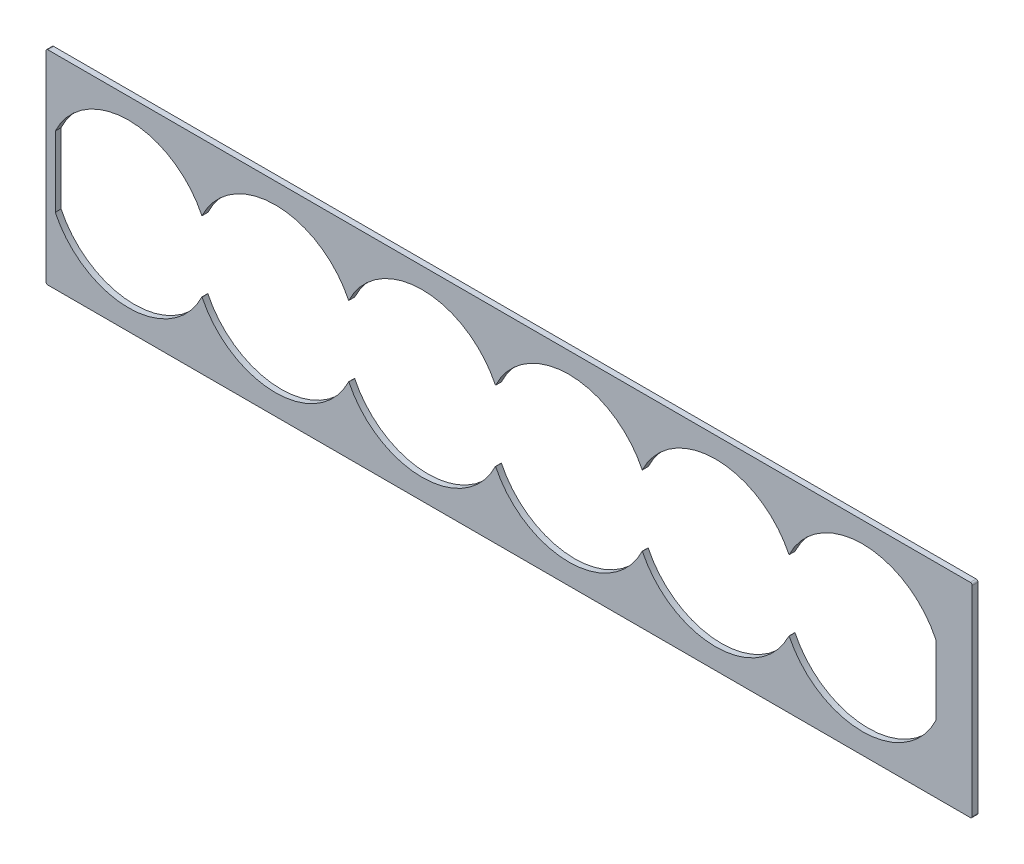
ISO-10303-21;
HEADER;
FILE_DESCRIPTION(('STEP AP214'),'2;1');
FILE_NAME('part.step','',(''),(''),'','','');
FILE_SCHEMA(('AUTOMOTIVE_DESIGN { 1 0 10303 214 1 1 1 1 }'));
ENDSEC;
DATA;
#1=APPLICATION_CONTEXT('core data for automotive mechanical design processes');
#2=APPLICATION_PROTOCOL_DEFINITION('international standard','automotive_design',2000,#1);
#3=PRODUCT_CONTEXT('',#1,'mechanical');
#4=PRODUCT('Part','Part','',(#3));
#5=PRODUCT_RELATED_PRODUCT_CATEGORY('part','',(#4));
#6=PRODUCT_DEFINITION_FORMATION('','',#4);
#7=PRODUCT_DEFINITION_CONTEXT('part definition',#1,'design');
#8=PRODUCT_DEFINITION('design','',#6,#7);
#9=PRODUCT_DEFINITION_SHAPE('','',#8);
#10=(LENGTH_UNIT() NAMED_UNIT(*) SI_UNIT(.MILLI.,.METRE.));
#11=(NAMED_UNIT(*) PLANE_ANGLE_UNIT() SI_UNIT($,.RADIAN.));
#12=(NAMED_UNIT(*) SI_UNIT($,.STERADIAN.) SOLID_ANGLE_UNIT());
#13=UNCERTAINTY_MEASURE_WITH_UNIT(LENGTH_MEASURE(1.E-05),#10,'distance_accuracy_value','');
#14=(GEOMETRIC_REPRESENTATION_CONTEXT(3) GLOBAL_UNCERTAINTY_ASSIGNED_CONTEXT((#13)) GLOBAL_UNIT_ASSIGNED_CONTEXT((#10,
#11,#12)) REPRESENTATION_CONTEXT('',''));
#15=CARTESIAN_POINT('',(0.,0.,0.));
#16=DIRECTION('',(0.,0.,1.));
#17=DIRECTION('',(1.,0.,0.));
#18=AXIS2_PLACEMENT_3D('',#15,#16,#17);
#19=CARTESIAN_POINT('',(0.,0.,4.));
#20=DIRECTION('',(0.,0.,-1.));
#21=DIRECTION('',(-1.,0.,0.));
#22=AXIS2_PLACEMENT_3D('',#19,#20,#21);
#23=PLANE('',#22);
#24=DIRECTION('',(0.,1.,0.));
#25=VECTOR('',#24,1.);
#26=CARTESIAN_POINT('',(635.,0.,4.));
#27=LINE('',#26,#25);
#28=CARTESIAN_POINT('',(635.,1.27,4.));
#29=VERTEX_POINT('',#28);
#30=CARTESIAN_POINT('',(635.,138.43,4.));
#31=VERTEX_POINT('',#30);
#32=EDGE_CURVE('E430',#29,#31,#27,.T.);
#33=ORIENTED_EDGE('',*,*,#32,.T.);
#34=CARTESIAN_POINT('',(633.73,138.43,4.));
#35=DIRECTION('',(0.,0.,-1.));
#36=DIRECTION('',(-1.,0.,0.));
#37=AXIS2_PLACEMENT_3D('',#34,#35,#36);
#38=CIRCLE('',#37,1.27);
#39=CARTESIAN_POINT('',(633.73,139.7,4.));
#40=VERTEX_POINT('',#39);
#41=EDGE_CURVE('E473',#31,#40,#38,.F.);
#42=ORIENTED_EDGE('',*,*,#41,.T.);
#43=DIRECTION('',(-1.,0.,0.));
#44=VECTOR('',#43,1.);
#45=CARTESIAN_POINT('',(0.,139.7,4.));
#46=LINE('',#45,#44);
#47=CARTESIAN_POINT('',(1.27000000000001,139.7,4.));
#48=VERTEX_POINT('',#47);
#49=EDGE_CURVE('E433',#40,#48,#46,.T.);
#50=ORIENTED_EDGE('',*,*,#49,.T.);
#51=CARTESIAN_POINT('',(1.27000000000001,138.43,4.));
#52=DIRECTION('',(0.,0.,-1.));
#53=DIRECTION('',(-1.,0.,0.));
#54=AXIS2_PLACEMENT_3D('',#51,#52,#53);
#55=CIRCLE('',#54,1.27);
#56=CARTESIAN_POINT('',(0.,138.43,4.));
#57=VERTEX_POINT('',#56);
#58=EDGE_CURVE('E470',#48,#57,#55,.F.);
#59=ORIENTED_EDGE('',*,*,#58,.T.);
#60=DIRECTION('',(0.,-1.,0.));
#61=VECTOR('',#60,1.);
#62=CARTESIAN_POINT('',(0.,0.,4.));
#63=LINE('',#62,#61);
#64=CARTESIAN_POINT('',(0.,1.27,4.));
#65=VERTEX_POINT('',#64);
#66=EDGE_CURVE('E437',#57,#65,#63,.T.);
#67=ORIENTED_EDGE('',*,*,#66,.T.);
#68=CARTESIAN_POINT('',(1.27,1.27,4.));
#69=DIRECTION('',(0.,0.,-1.));
#70=DIRECTION('',(-1.,0.,0.));
#71=AXIS2_PLACEMENT_3D('',#68,#69,#70);
#72=CIRCLE('',#71,1.27);
#73=CARTESIAN_POINT('',(1.27,0.,4.));
#74=VERTEX_POINT('',#73);
#75=EDGE_CURVE('E59',#65,#74,#72,.F.);
#76=ORIENTED_EDGE('',*,*,#75,.T.);
#77=DIRECTION('',(1.,0.,0.));
#78=VECTOR('',#77,1.);
#79=CARTESIAN_POINT('',(0.,0.,4.));
#80=LINE('',#79,#78);
#81=CARTESIAN_POINT('',(633.73,0.,4.));
#82=VERTEX_POINT('',#81);
#83=EDGE_CURVE('E439',#74,#82,#80,.T.);
#84=ORIENTED_EDGE('',*,*,#83,.T.);
#85=CARTESIAN_POINT('',(633.73,1.27,4.));
#86=DIRECTION('',(0.,0.,-1.));
#87=DIRECTION('',(-1.,0.,0.));
#88=AXIS2_PLACEMENT_3D('',#85,#86,#87);
#89=CIRCLE('',#88,1.27);
#90=EDGE_CURVE('E468',#82,#29,#89,.F.);
#91=ORIENTED_EDGE('',*,*,#90,.T.);
#92=EDGE_LOOP('',(#33,#42,#50,#59,#67,#76,#84,#91));
#93=FACE_BOUND('',#92,.T.);
#94=CARTESIAN_POINT('',(56.604,69.8499999999999,4.));
#95=DIRECTION('',(0.,0.,1.));
#96=DIRECTION('',(1.,0.,0.));
#97=AXIS2_PLACEMENT_3D('',#94,#95,#96);
#98=CIRCLE('',#97,55.754);
#99=CARTESIAN_POINT('',(106.858,93.9963040650116,4.));
#100=VERTEX_POINT('',#99);
#101=CARTESIAN_POINT('',(6.35,93.9963040650116,4.));
#102=VERTEX_POINT('',#101);
#103=EDGE_CURVE('E248',#100,#102,#98,.T.);
#104=ORIENTED_EDGE('',*,*,#103,.F.);
#105=DIRECTION('',(-1.,0.,0.));
#106=VECTOR('',#105,1.);
#107=CARTESIAN_POINT('',(106.858,93.9963040650116,4.));
#108=LINE('',#107,#106);
#109=CARTESIAN_POINT('',(106.985,93.9963040650116,4.));
#110=VERTEX_POINT('',#109);
#111=EDGE_CURVE('E316',#110,#100,#108,.T.);
#112=ORIENTED_EDGE('',*,*,#111,.F.);
#113=CARTESIAN_POINT('',(157.239,69.8499999999999,4.));
#114=DIRECTION('',(0.,0.,1.));
#115=DIRECTION('',(1.,0.,0.));
#116=AXIS2_PLACEMENT_3D('',#113,#114,#115);
#117=CIRCLE('',#116,55.754);
#118=CARTESIAN_POINT('',(207.493,93.9963040650116,4.));
#119=VERTEX_POINT('',#118);
#120=EDGE_CURVE('E313',#119,#110,#117,.T.);
#121=ORIENTED_EDGE('',*,*,#120,.F.);
#122=DIRECTION('',(-1.,0.,0.));
#123=VECTOR('',#122,1.);
#124=CARTESIAN_POINT('',(207.493,93.9963040650116,4.));
#125=LINE('',#124,#123);
#126=CARTESIAN_POINT('',(207.62,93.9963040650116,4.));
#127=VERTEX_POINT('',#126);
#128=EDGE_CURVE('E311',#127,#119,#125,.T.);
#129=ORIENTED_EDGE('',*,*,#128,.F.);
#130=CARTESIAN_POINT('',(257.874,69.8499999999999,4.));
#131=DIRECTION('',(0.,0.,1.));
#132=DIRECTION('',(1.,0.,0.));
#133=AXIS2_PLACEMENT_3D('',#130,#131,#132);
#134=CIRCLE('',#133,55.754);
#135=CARTESIAN_POINT('',(308.128,93.9963040650116,4.));
#136=VERTEX_POINT('',#135);
#137=EDGE_CURVE('E309',#136,#127,#134,.T.);
#138=ORIENTED_EDGE('',*,*,#137,.F.);
#139=DIRECTION('',(-1.,0.,0.));
#140=VECTOR('',#139,1.);
#141=CARTESIAN_POINT('',(308.128,93.9963040650116,4.));
#142=LINE('',#141,#140);
#143=CARTESIAN_POINT('',(308.255,93.9963040650116,4.));
#144=VERTEX_POINT('',#143);
#145=EDGE_CURVE('E307',#144,#136,#142,.T.);
#146=ORIENTED_EDGE('',*,*,#145,.F.);
#147=CARTESIAN_POINT('',(358.509,69.8499999999999,4.));
#148=DIRECTION('',(0.,0.,1.));
#149=DIRECTION('',(1.,0.,0.));
#150=AXIS2_PLACEMENT_3D('',#147,#148,#149);
#151=CIRCLE('',#150,55.754);
#152=CARTESIAN_POINT('',(408.763,93.9963040650116,4.));
#153=VERTEX_POINT('',#152);
#154=EDGE_CURVE('E305',#153,#144,#151,.T.);
#155=ORIENTED_EDGE('',*,*,#154,.F.);
#156=DIRECTION('',(-1.,0.,0.));
#157=VECTOR('',#156,1.);
#158=CARTESIAN_POINT('',(408.763,93.9963040650116,4.));
#159=LINE('',#158,#157);
#160=CARTESIAN_POINT('',(408.89,93.9963040650116,4.));
#161=VERTEX_POINT('',#160);
#162=EDGE_CURVE('E303',#161,#153,#159,.T.);
#163=ORIENTED_EDGE('',*,*,#162,.F.);
#164=CARTESIAN_POINT('',(459.144,69.8499999999999,4.));
#165=DIRECTION('',(0.,0.,1.));
#166=DIRECTION('',(1.,0.,0.));
#167=AXIS2_PLACEMENT_3D('',#164,#165,#166);
#168=CIRCLE('',#167,55.754);
#169=CARTESIAN_POINT('',(509.398,93.9963040650116,4.));
#170=VERTEX_POINT('',#169);
#171=EDGE_CURVE('E301',#170,#161,#168,.T.);
#172=ORIENTED_EDGE('',*,*,#171,.F.);
#173=DIRECTION('',(-1.,0.,0.));
#174=VECTOR('',#173,1.);
#175=CARTESIAN_POINT('',(509.398,93.9963040650116,4.));
#176=LINE('',#175,#174);
#177=CARTESIAN_POINT('',(509.525,93.9963040650116,4.));
#178=VERTEX_POINT('',#177);
#179=EDGE_CURVE('E299',#178,#170,#176,.T.);
#180=ORIENTED_EDGE('',*,*,#179,.F.);
#181=CARTESIAN_POINT('',(559.779,69.8499999999999,4.));
#182=DIRECTION('',(0.,0.,1.));
#183=DIRECTION('',(1.,0.,0.));
#184=AXIS2_PLACEMENT_3D('',#181,#182,#183);
#185=CIRCLE('',#184,55.754);
#186=CARTESIAN_POINT('',(610.033,93.9963040650116,4.));
#187=VERTEX_POINT('',#186);
#188=EDGE_CURVE('E297',#187,#178,#185,.T.);
#189=ORIENTED_EDGE('',*,*,#188,.F.);
#190=DIRECTION('',(0.,1.,0.));
#191=VECTOR('',#190,1.);
#192=CARTESIAN_POINT('',(610.033,93.9963040650116,4.));
#193=LINE('',#192,#191);
#194=CARTESIAN_POINT('',(610.033,45.7036959349883,4.));
#195=VERTEX_POINT('',#194);
#196=EDGE_CURVE('E295',#195,#187,#193,.T.);
#197=ORIENTED_EDGE('',*,*,#196,.F.);
#198=CARTESIAN_POINT('',(559.779,69.8499999999999,4.));
#199=DIRECTION('',(0.,0.,1.));
#200=DIRECTION('',(1.,0.,0.));
#201=AXIS2_PLACEMENT_3D('',#198,#199,#200);
#202=CIRCLE('',#201,55.754);
#203=CARTESIAN_POINT('',(509.525,45.7036959349884,4.));
#204=VERTEX_POINT('',#203);
#205=EDGE_CURVE('E293',#204,#195,#202,.T.);
#206=ORIENTED_EDGE('',*,*,#205,.F.);
#207=DIRECTION('',(1.,8.74191357972645E-13,0.));
#208=VECTOR('',#207,1.);
#209=CARTESIAN_POINT('',(509.398,45.7036959349883,4.));
#210=LINE('',#209,#208);
#211=CARTESIAN_POINT('',(509.398,45.7036959349883,4.));
#212=VERTEX_POINT('',#211);
#213=EDGE_CURVE('E291',#212,#204,#210,.T.);
#214=ORIENTED_EDGE('',*,*,#213,.F.);
#215=CARTESIAN_POINT('',(459.144,69.8499999999999,4.));
#216=DIRECTION('',(0.,0.,1.));
#217=DIRECTION('',(1.,0.,0.));
#218=AXIS2_PLACEMENT_3D('',#215,#216,#217);
#219=CIRCLE('',#218,55.754);
#220=CARTESIAN_POINT('',(408.89,45.7036959349884,4.));
#221=VERTEX_POINT('',#220);
#222=EDGE_CURVE('E289',#221,#212,#219,.T.);
#223=ORIENTED_EDGE('',*,*,#222,.F.);
#224=DIRECTION('',(1.,8.74191357972263E-13,0.));
#225=VECTOR('',#224,1.);
#226=CARTESIAN_POINT('',(408.763,45.7036959349883,4.));
#227=LINE('',#226,#225);
#228=CARTESIAN_POINT('',(408.763,45.7036959349883,4.));
#229=VERTEX_POINT('',#228);
#230=EDGE_CURVE('E287',#229,#221,#227,.T.);
#231=ORIENTED_EDGE('',*,*,#230,.F.);
#232=CARTESIAN_POINT('',(358.509,69.8499999999999,4.));
#233=DIRECTION('',(0.,0.,1.));
#234=DIRECTION('',(1.,0.,0.));
#235=AXIS2_PLACEMENT_3D('',#232,#233,#234);
#236=CIRCLE('',#235,55.754);
#237=CARTESIAN_POINT('',(308.255,45.7036959349884,4.));
#238=VERTEX_POINT('',#237);
#239=EDGE_CURVE('E285',#238,#229,#236,.T.);
#240=ORIENTED_EDGE('',*,*,#239,.F.);
#241=DIRECTION('',(1.,8.74191357971499E-13,0.));
#242=VECTOR('',#241,1.);
#243=CARTESIAN_POINT('',(308.128,45.7036959349883,4.));
#244=LINE('',#243,#242);
#245=CARTESIAN_POINT('',(308.128,45.7036959349883,4.));
#246=VERTEX_POINT('',#245);
#247=EDGE_CURVE('E283',#246,#238,#244,.T.);
#248=ORIENTED_EDGE('',*,*,#247,.F.);
#249=CARTESIAN_POINT('',(257.874,69.8499999999999,4.));
#250=DIRECTION('',(0.,0.,1.));
#251=DIRECTION('',(1.,0.,0.));
#252=AXIS2_PLACEMENT_3D('',#249,#250,#251);
#253=CIRCLE('',#252,55.754);
#254=CARTESIAN_POINT('',(207.62,45.7036959349884,4.));
#255=VERTEX_POINT('',#254);
#256=EDGE_CURVE('E281',#255,#246,#253,.T.);
#257=ORIENTED_EDGE('',*,*,#256,.F.);
#258=DIRECTION('',(1.,8.74191357973027E-13,0.));
#259=VECTOR('',#258,1.);
#260=CARTESIAN_POINT('',(207.62,45.7036959349884,4.));
#261=LINE('',#260,#259);
#262=CARTESIAN_POINT('',(207.493,45.7036959349883,4.));
#263=VERTEX_POINT('',#262);
#264=EDGE_CURVE('E279',#263,#255,#261,.T.);
#265=ORIENTED_EDGE('',*,*,#264,.F.);
#266=CARTESIAN_POINT('',(157.239,69.8499999999999,4.));
#267=DIRECTION('',(0.,0.,1.));
#268=DIRECTION('',(1.,0.,0.));
#269=AXIS2_PLACEMENT_3D('',#266,#267,#268);
#270=CIRCLE('',#269,55.754);
#271=CARTESIAN_POINT('',(106.985,45.7036959349884,4.));
#272=VERTEX_POINT('',#271);
#273=EDGE_CURVE('E277',#272,#263,#270,.T.);
#274=ORIENTED_EDGE('',*,*,#273,.F.);
#275=DIRECTION('',(1.,8.74191357973027E-13,0.));
#276=VECTOR('',#275,1.);
#277=CARTESIAN_POINT('',(106.985,45.7036959349884,4.));
#278=LINE('',#277,#276);
#279=CARTESIAN_POINT('',(106.858,45.7036959349883,4.));
#280=VERTEX_POINT('',#279);
#281=EDGE_CURVE('E273',#280,#272,#278,.T.);
#282=ORIENTED_EDGE('',*,*,#281,.F.);
#283=CARTESIAN_POINT('',(56.604,69.8499999999999,4.));
#284=DIRECTION('',(0.,0.,1.));
#285=DIRECTION('',(1.,0.,0.));
#286=AXIS2_PLACEMENT_3D('',#283,#284,#285);
#287=CIRCLE('',#286,55.754);
#288=CARTESIAN_POINT('',(6.35,45.7036959349884,4.));
#289=VERTEX_POINT('',#288);
#290=EDGE_CURVE('E271',#289,#280,#287,.T.);
#291=ORIENTED_EDGE('',*,*,#290,.F.);
#292=DIRECTION('',(0.,-1.,0.));
#293=VECTOR('',#292,1.);
#294=CARTESIAN_POINT('',(6.35,93.9963040650116,4.));
#295=LINE('',#294,#293);
#296=EDGE_CURVE('E258',#102,#289,#295,.T.);
#297=ORIENTED_EDGE('',*,*,#296,.F.);
#298=EDGE_LOOP('',(#104,#112,#121,#129,#138,#146,#155,#163,#172,#180,#189,#197,#206,#214,#223,
#231,#240,#248,#257,#265,#274,#282,#291,#297));
#299=FACE_BOUND('',#298,.T.);
#300=ADVANCED_FACE('F37',(#93,#299),#23,.F.);
#301=CARTESIAN_POINT('',(0.,0.,0.));
#302=DIRECTION('',(0.,0.,-1.));
#303=DIRECTION('',(-1.,0.,0.));
#304=AXIS2_PLACEMENT_3D('',#301,#302,#303);
#305=PLANE('',#304);
#306=DIRECTION('',(-1.,0.,0.));
#307=VECTOR('',#306,1.);
#308=CARTESIAN_POINT('',(0.,139.7,0.));
#309=LINE('',#308,#307);
#310=CARTESIAN_POINT('',(633.73,139.7,0.));
#311=VERTEX_POINT('',#310);
#312=CARTESIAN_POINT('',(1.27000000000001,139.7,0.));
#313=VERTEX_POINT('',#312);
#314=EDGE_CURVE('E444',#311,#313,#309,.T.);
#315=ORIENTED_EDGE('',*,*,#314,.F.);
#316=CARTESIAN_POINT('',(633.73,138.43,0.));
#317=DIRECTION('',(0.,0.,-1.));
#318=DIRECTION('',(-1.,0.,0.));
#319=AXIS2_PLACEMENT_3D('',#316,#317,#318);
#320=CIRCLE('',#319,1.27);
#321=CARTESIAN_POINT('',(635.,138.43,0.));
#322=VERTEX_POINT('',#321);
#323=EDGE_CURVE('E461',#311,#322,#320,.T.);
#324=ORIENTED_EDGE('',*,*,#323,.T.);
#325=DIRECTION('',(0.,1.,0.));
#326=VECTOR('',#325,1.);
#327=CARTESIAN_POINT('',(635.,0.,0.));
#328=LINE('',#327,#326);
#329=CARTESIAN_POINT('',(635.,1.27,0.));
#330=VERTEX_POINT('',#329);
#331=EDGE_CURVE('E266',#330,#322,#328,.T.);
#332=ORIENTED_EDGE('',*,*,#331,.F.);
#333=CARTESIAN_POINT('',(633.73,1.27,0.));
#334=DIRECTION('',(0.,0.,-1.));
#335=DIRECTION('',(-1.,0.,0.));
#336=AXIS2_PLACEMENT_3D('',#333,#334,#335);
#337=CIRCLE('',#336,1.27);
#338=CARTESIAN_POINT('',(633.73,0.,0.));
#339=VERTEX_POINT('',#338);
#340=EDGE_CURVE('E455',#330,#339,#337,.T.);
#341=ORIENTED_EDGE('',*,*,#340,.T.);
#342=DIRECTION('',(1.,0.,0.));
#343=VECTOR('',#342,1.);
#344=CARTESIAN_POINT('',(0.,0.,0.));
#345=LINE('',#344,#343);
#346=CARTESIAN_POINT('',(1.27,0.,0.));
#347=VERTEX_POINT('',#346);
#348=EDGE_CURVE('E434',#347,#339,#345,.T.);
#349=ORIENTED_EDGE('',*,*,#348,.F.);
#350=CARTESIAN_POINT('',(1.27,1.27,0.));
#351=DIRECTION('',(0.,0.,-1.));
#352=DIRECTION('',(-1.,0.,0.));
#353=AXIS2_PLACEMENT_3D('',#350,#351,#352);
#354=CIRCLE('',#353,1.27);
#355=CARTESIAN_POINT('',(0.,1.27,0.));
#356=VERTEX_POINT('',#355);
#357=EDGE_CURVE('E459',#347,#356,#354,.T.);
#358=ORIENTED_EDGE('',*,*,#357,.T.);
#359=DIRECTION('',(0.,-1.,0.));
#360=VECTOR('',#359,1.);
#361=CARTESIAN_POINT('',(0.,0.,0.));
#362=LINE('',#361,#360);
#363=CARTESIAN_POINT('',(0.,138.43,0.));
#364=VERTEX_POINT('',#363);
#365=EDGE_CURVE('E447',#364,#356,#362,.T.);
#366=ORIENTED_EDGE('',*,*,#365,.F.);
#367=CARTESIAN_POINT('',(1.27000000000001,138.43,0.));
#368=DIRECTION('',(0.,0.,-1.));
#369=DIRECTION('',(-1.,0.,0.));
#370=AXIS2_PLACEMENT_3D('',#367,#368,#369);
#371=CIRCLE('',#370,1.27);
#372=EDGE_CURVE('E457',#364,#313,#371,.T.);
#373=ORIENTED_EDGE('',*,*,#372,.T.);
#374=EDGE_LOOP('',(#315,#324,#332,#341,#349,#358,#366,#373));
#375=FACE_BOUND('',#374,.T.);
#376=DIRECTION('',(-1.,0.,0.));
#377=VECTOR('',#376,1.);
#378=CARTESIAN_POINT('',(106.858,93.9963040650116,0.));
#379=LINE('',#378,#377);
#380=CARTESIAN_POINT('',(106.985,93.9963040650116,0.));
#381=VERTEX_POINT('',#380);
#382=CARTESIAN_POINT('',(106.858,93.9963040650116,0.));
#383=VERTEX_POINT('',#382);
#384=EDGE_CURVE('E259',#381,#383,#379,.T.);
#385=ORIENTED_EDGE('',*,*,#384,.T.);
#386=CARTESIAN_POINT('',(56.604,69.8499999999999,0.));
#387=DIRECTION('',(0.,0.,1.));
#388=DIRECTION('',(1.,0.,0.));
#389=AXIS2_PLACEMENT_3D('',#386,#387,#388);
#390=CIRCLE('',#389,55.754);
#391=CARTESIAN_POINT('',(6.35,93.9963040650116,0.));
#392=VERTEX_POINT('',#391);
#393=EDGE_CURVE('E318',#383,#392,#390,.T.);
#394=ORIENTED_EDGE('',*,*,#393,.T.);
#395=DIRECTION('',(0.,-1.,0.));
#396=VECTOR('',#395,1.);
#397=CARTESIAN_POINT('',(6.35,93.9963040650116,0.));
#398=LINE('',#397,#396);
#399=CARTESIAN_POINT('',(6.35,45.7036959349884,0.));
#400=VERTEX_POINT('',#399);
#401=EDGE_CURVE('E265',#392,#400,#398,.T.);
#402=ORIENTED_EDGE('',*,*,#401,.T.);
#403=CARTESIAN_POINT('',(56.604,69.8499999999999,0.));
#404=DIRECTION('',(0.,0.,1.));
#405=DIRECTION('',(1.,0.,0.));
#406=AXIS2_PLACEMENT_3D('',#403,#404,#405);
#407=CIRCLE('',#406,55.754);
#408=CARTESIAN_POINT('',(106.858,45.7036959349883,0.));
#409=VERTEX_POINT('',#408);
#410=EDGE_CURVE('E321',#400,#409,#407,.T.);
#411=ORIENTED_EDGE('',*,*,#410,.T.);
#412=DIRECTION('',(1.,8.74191357973027E-13,0.));
#413=VECTOR('',#412,1.);
#414=CARTESIAN_POINT('',(106.985,45.7036959349884,0.));
#415=LINE('',#414,#413);
#416=CARTESIAN_POINT('',(106.985,45.7036959349884,0.));
#417=VERTEX_POINT('',#416);
#418=EDGE_CURVE('E324',#409,#417,#415,.T.);
#419=ORIENTED_EDGE('',*,*,#418,.T.);
#420=CARTESIAN_POINT('',(157.239,69.8499999999999,0.));
#421=DIRECTION('',(0.,0.,1.));
#422=DIRECTION('',(1.,0.,0.));
#423=AXIS2_PLACEMENT_3D('',#420,#421,#422);
#424=CIRCLE('',#423,55.754);
#425=CARTESIAN_POINT('',(207.493,45.7036959349883,0.));
#426=VERTEX_POINT('',#425);
#427=EDGE_CURVE('E327',#417,#426,#424,.T.);
#428=ORIENTED_EDGE('',*,*,#427,.T.);
#429=DIRECTION('',(1.,8.74191357973027E-13,0.));
#430=VECTOR('',#429,1.);
#431=CARTESIAN_POINT('',(207.62,45.7036959349884,0.));
#432=LINE('',#431,#430);
#433=CARTESIAN_POINT('',(207.62,45.7036959349884,0.));
#434=VERTEX_POINT('',#433);
#435=EDGE_CURVE('E330',#426,#434,#432,.T.);
#436=ORIENTED_EDGE('',*,*,#435,.T.);
#437=CARTESIAN_POINT('',(257.874,69.8499999999999,0.));
#438=DIRECTION('',(0.,0.,1.));
#439=DIRECTION('',(1.,0.,0.));
#440=AXIS2_PLACEMENT_3D('',#437,#438,#439);
#441=CIRCLE('',#440,55.754);
#442=CARTESIAN_POINT('',(308.128,45.7036959349883,0.));
#443=VERTEX_POINT('',#442);
#444=EDGE_CURVE('E333',#434,#443,#441,.T.);
#445=ORIENTED_EDGE('',*,*,#444,.T.);
#446=DIRECTION('',(1.,8.74191357971499E-13,0.));
#447=VECTOR('',#446,1.);
#448=CARTESIAN_POINT('',(308.128,45.7036959349883,0.));
#449=LINE('',#448,#447);
#450=CARTESIAN_POINT('',(308.255,45.7036959349884,0.));
#451=VERTEX_POINT('',#450);
#452=EDGE_CURVE('E336',#443,#451,#449,.T.);
#453=ORIENTED_EDGE('',*,*,#452,.T.);
#454=CARTESIAN_POINT('',(358.509,69.8499999999999,0.));
#455=DIRECTION('',(0.,0.,1.));
#456=DIRECTION('',(1.,0.,0.));
#457=AXIS2_PLACEMENT_3D('',#454,#455,#456);
#458=CIRCLE('',#457,55.754);
#459=CARTESIAN_POINT('',(408.763,45.7036959349883,0.));
#460=VERTEX_POINT('',#459);
#461=EDGE_CURVE('E339',#451,#460,#458,.T.);
#462=ORIENTED_EDGE('',*,*,#461,.T.);
#463=DIRECTION('',(1.,8.74191357972263E-13,0.));
#464=VECTOR('',#463,1.);
#465=CARTESIAN_POINT('',(408.763,45.7036959349883,0.));
#466=LINE('',#465,#464);
#467=CARTESIAN_POINT('',(408.89,45.7036959349884,0.));
#468=VERTEX_POINT('',#467);
#469=EDGE_CURVE('E342',#460,#468,#466,.T.);
#470=ORIENTED_EDGE('',*,*,#469,.T.);
#471=CARTESIAN_POINT('',(459.144,69.8499999999999,0.));
#472=DIRECTION('',(0.,0.,1.));
#473=DIRECTION('',(1.,0.,0.));
#474=AXIS2_PLACEMENT_3D('',#471,#472,#473);
#475=CIRCLE('',#474,55.754);
#476=CARTESIAN_POINT('',(509.398,45.7036959349883,0.));
#477=VERTEX_POINT('',#476);
#478=EDGE_CURVE('E345',#468,#477,#475,.T.);
#479=ORIENTED_EDGE('',*,*,#478,.T.);
#480=DIRECTION('',(1.,8.74191357972645E-13,0.));
#481=VECTOR('',#480,1.);
#482=CARTESIAN_POINT('',(509.398,45.7036959349883,0.));
#483=LINE('',#482,#481);
#484=CARTESIAN_POINT('',(509.525,45.7036959349884,0.));
#485=VERTEX_POINT('',#484);
#486=EDGE_CURVE('E348',#477,#485,#483,.T.);
#487=ORIENTED_EDGE('',*,*,#486,.T.);
#488=CARTESIAN_POINT('',(559.779,69.8499999999999,0.));
#489=DIRECTION('',(0.,0.,1.));
#490=DIRECTION('',(1.,0.,0.));
#491=AXIS2_PLACEMENT_3D('',#488,#489,#490);
#492=CIRCLE('',#491,55.754);
#493=CARTESIAN_POINT('',(610.033,45.7036959349883,0.));
#494=VERTEX_POINT('',#493);
#495=EDGE_CURVE('E351',#485,#494,#492,.T.);
#496=ORIENTED_EDGE('',*,*,#495,.T.);
#497=DIRECTION('',(0.,1.,0.));
#498=VECTOR('',#497,1.);
#499=CARTESIAN_POINT('',(610.033,93.9963040650116,0.));
#500=LINE('',#499,#498);
#501=CARTESIAN_POINT('',(610.033,93.9963040650116,0.));
#502=VERTEX_POINT('',#501);
#503=EDGE_CURVE('E354',#494,#502,#500,.T.);
#504=ORIENTED_EDGE('',*,*,#503,.T.);
#505=CARTESIAN_POINT('',(559.779,69.8499999999999,0.));
#506=DIRECTION('',(0.,0.,1.));
#507=DIRECTION('',(1.,0.,0.));
#508=AXIS2_PLACEMENT_3D('',#505,#506,#507);
#509=CIRCLE('',#508,55.754);
#510=CARTESIAN_POINT('',(509.525,93.9963040650116,0.));
#511=VERTEX_POINT('',#510);
#512=EDGE_CURVE('E357',#502,#511,#509,.T.);
#513=ORIENTED_EDGE('',*,*,#512,.T.);
#514=DIRECTION('',(-1.,0.,0.));
#515=VECTOR('',#514,1.);
#516=CARTESIAN_POINT('',(509.398,93.9963040650116,0.));
#517=LINE('',#516,#515);
#518=CARTESIAN_POINT('',(509.398,93.9963040650116,0.));
#519=VERTEX_POINT('',#518);
#520=EDGE_CURVE('E360',#511,#519,#517,.T.);
#521=ORIENTED_EDGE('',*,*,#520,.T.);
#522=CARTESIAN_POINT('',(459.144,69.8499999999999,0.));
#523=DIRECTION('',(0.,0.,1.));
#524=DIRECTION('',(1.,0.,0.));
#525=AXIS2_PLACEMENT_3D('',#522,#523,#524);
#526=CIRCLE('',#525,55.754);
#527=CARTESIAN_POINT('',(408.89,93.9963040650116,0.));
#528=VERTEX_POINT('',#527);
#529=EDGE_CURVE('E363',#519,#528,#526,.T.);
#530=ORIENTED_EDGE('',*,*,#529,.T.);
#531=DIRECTION('',(-1.,0.,0.));
#532=VECTOR('',#531,1.);
#533=CARTESIAN_POINT('',(408.763,93.9963040650116,0.));
#534=LINE('',#533,#532);
#535=CARTESIAN_POINT('',(408.763,93.9963040650116,0.));
#536=VERTEX_POINT('',#535);
#537=EDGE_CURVE('E366',#528,#536,#534,.T.);
#538=ORIENTED_EDGE('',*,*,#537,.T.);
#539=CARTESIAN_POINT('',(358.509,69.8499999999999,0.));
#540=DIRECTION('',(0.,0.,1.));
#541=DIRECTION('',(1.,0.,0.));
#542=AXIS2_PLACEMENT_3D('',#539,#540,#541);
#543=CIRCLE('',#542,55.754);
#544=CARTESIAN_POINT('',(308.255,93.9963040650116,0.));
#545=VERTEX_POINT('',#544);
#546=EDGE_CURVE('E369',#536,#545,#543,.T.);
#547=ORIENTED_EDGE('',*,*,#546,.T.);
#548=DIRECTION('',(-1.,0.,0.));
#549=VECTOR('',#548,1.);
#550=CARTESIAN_POINT('',(308.128,93.9963040650116,0.));
#551=LINE('',#550,#549);
#552=CARTESIAN_POINT('',(308.128,93.9963040650116,0.));
#553=VERTEX_POINT('',#552);
#554=EDGE_CURVE('E372',#545,#553,#551,.T.);
#555=ORIENTED_EDGE('',*,*,#554,.T.);
#556=CARTESIAN_POINT('',(257.874,69.8499999999999,0.));
#557=DIRECTION('',(0.,0.,1.));
#558=DIRECTION('',(1.,0.,0.));
#559=AXIS2_PLACEMENT_3D('',#556,#557,#558);
#560=CIRCLE('',#559,55.754);
#561=CARTESIAN_POINT('',(207.62,93.9963040650116,0.));
#562=VERTEX_POINT('',#561);
#563=EDGE_CURVE('E375',#553,#562,#560,.T.);
#564=ORIENTED_EDGE('',*,*,#563,.T.);
#565=DIRECTION('',(-1.,0.,0.));
#566=VECTOR('',#565,1.);
#567=CARTESIAN_POINT('',(207.493,93.9963040650116,0.));
#568=LINE('',#567,#566);
#569=CARTESIAN_POINT('',(207.493,93.9963040650116,0.));
#570=VERTEX_POINT('',#569);
#571=EDGE_CURVE('E378',#562,#570,#568,.T.);
#572=ORIENTED_EDGE('',*,*,#571,.T.);
#573=CARTESIAN_POINT('',(157.239,69.8499999999999,0.));
#574=DIRECTION('',(0.,0.,1.));
#575=DIRECTION('',(1.,0.,0.));
#576=AXIS2_PLACEMENT_3D('',#573,#574,#575);
#577=CIRCLE('',#576,55.754);
#578=EDGE_CURVE('E381',#570,#381,#577,.T.);
#579=ORIENTED_EDGE('',*,*,#578,.T.);
#580=EDGE_LOOP('',(#385,#394,#402,#411,#419,#428,#436,#445,#453,#462,#470,#479,#487,#496,#504,
#513,#521,#530,#538,#547,#555,#564,#572,#579));
#581=FACE_BOUND('',#580,.T.);
#582=ADVANCED_FACE('F489',(#375,#581),#305,.T.);
#583=CARTESIAN_POINT('',(635.,0.,4.));
#584=DIRECTION('',(-1.,0.,0.));
#585=DIRECTION('',(0.,0.,1.));
#586=AXIS2_PLACEMENT_3D('',#583,#584,#585);
#587=PLANE('',#586);
#588=ORIENTED_EDGE('',*,*,#331,.T.);
#589=DIRECTION('',(0.,0.,-1.));
#590=VECTOR('',#589,1.);
#591=CARTESIAN_POINT('',(635.,138.43,4.));
#592=LINE('',#591,#590);
#593=EDGE_CURVE('E466',#322,#31,#592,.F.);
#594=ORIENTED_EDGE('',*,*,#593,.T.);
#595=ORIENTED_EDGE('',*,*,#32,.F.);
#596=DIRECTION('',(0.,0.,-1.));
#597=VECTOR('',#596,1.);
#598=CARTESIAN_POINT('',(635.,1.27,4.));
#599=LINE('',#598,#597);
#600=EDGE_CURVE('E463',#29,#330,#599,.T.);
#601=ORIENTED_EDGE('',*,*,#600,.T.);
#602=EDGE_LOOP('',(#588,#594,#595,#601));
#603=FACE_BOUND('',#602,.T.);
#604=ADVANCED_FACE('F502',(#603),#587,.F.);
#605=CARTESIAN_POINT('',(0.,139.7,4.));
#606=DIRECTION('',(0.,-1.,0.));
#607=DIRECTION('',(0.,0.,-1.));
#608=AXIS2_PLACEMENT_3D('',#605,#606,#607);
#609=PLANE('',#608);
#610=ORIENTED_EDGE('',*,*,#49,.F.);
#611=DIRECTION('',(0.,0.,-1.));
#612=VECTOR('',#611,1.);
#613=CARTESIAN_POINT('',(633.73,139.7,4.));
#614=LINE('',#613,#612);
#615=EDGE_CURVE('E452',#40,#311,#614,.T.);
#616=ORIENTED_EDGE('',*,*,#615,.T.);
#617=ORIENTED_EDGE('',*,*,#314,.T.);
#618=DIRECTION('',(0.,0.,-1.));
#619=VECTOR('',#618,1.);
#620=CARTESIAN_POINT('',(1.27000000000001,139.7,4.));
#621=LINE('',#620,#619);
#622=EDGE_CURVE('E441',#313,#48,#621,.F.);
#623=ORIENTED_EDGE('',*,*,#622,.T.);
#624=EDGE_LOOP('',(#610,#616,#617,#623));
#625=FACE_BOUND('',#624,.T.);
#626=ADVANCED_FACE('F510',(#625),#609,.F.);
#627=CARTESIAN_POINT('',(0.,0.,4.));
#628=DIRECTION('',(1.,0.,0.));
#629=DIRECTION('',(0.,1.,0.));
#630=AXIS2_PLACEMENT_3D('',#627,#628,#629);
#631=PLANE('',#630);
#632=ORIENTED_EDGE('',*,*,#365,.T.);
#633=DIRECTION('',(0.,0.,-1.));
#634=VECTOR('',#633,1.);
#635=CARTESIAN_POINT('',(0.,1.27,4.));
#636=LINE('',#635,#634);
#637=EDGE_CURVE('E11',#356,#65,#636,.F.);
#638=ORIENTED_EDGE('',*,*,#637,.T.);
#639=ORIENTED_EDGE('',*,*,#66,.F.);
#640=DIRECTION('',(0.,0.,-1.));
#641=VECTOR('',#640,1.);
#642=CARTESIAN_POINT('',(0.,138.43,4.));
#643=LINE('',#642,#641);
#644=EDGE_CURVE('E45',#57,#364,#643,.T.);
#645=ORIENTED_EDGE('',*,*,#644,.T.);
#646=EDGE_LOOP('',(#632,#638,#639,#645));
#647=FACE_BOUND('',#646,.T.);
#648=ADVANCED_FACE('F483',(#647),#631,.F.);
#649=CARTESIAN_POINT('',(0.,0.,4.));
#650=DIRECTION('',(0.,1.,0.));
#651=DIRECTION('',(0.,0.,1.));
#652=AXIS2_PLACEMENT_3D('',#649,#650,#651);
#653=PLANE('',#652);
#654=ORIENTED_EDGE('',*,*,#83,.F.);
#655=DIRECTION('',(0.,0.,-1.));
#656=VECTOR('',#655,1.);
#657=CARTESIAN_POINT('',(1.27,0.,4.));
#658=LINE('',#657,#656);
#659=EDGE_CURVE('E476',#74,#347,#658,.T.);
#660=ORIENTED_EDGE('',*,*,#659,.T.);
#661=ORIENTED_EDGE('',*,*,#348,.T.);
#662=DIRECTION('',(0.,0.,-1.));
#663=VECTOR('',#662,1.);
#664=CARTESIAN_POINT('',(633.73,0.,4.));
#665=LINE('',#664,#663);
#666=EDGE_CURVE('E52',#339,#82,#665,.F.);
#667=ORIENTED_EDGE('',*,*,#666,.T.);
#668=EDGE_LOOP('',(#654,#660,#661,#667));
#669=FACE_BOUND('',#668,.T.);
#670=ADVANCED_FACE('F495',(#669),#653,.F.);
#671=CARTESIAN_POINT('',(56.604,69.8499999999999,4.));
#672=DIRECTION('',(0.,0.,-1.));
#673=DIRECTION('',(-1.,0.,0.));
#674=AXIS2_PLACEMENT_3D('',#671,#672,#673);
#675=CYLINDRICAL_SURFACE('',#674,55.754);
#676=ORIENTED_EDGE('',*,*,#393,.F.);
#677=DIRECTION('',(0.,0.,-1.));
#678=VECTOR('',#677,1.);
#679=CARTESIAN_POINT('',(106.858,93.9963040650116,4.));
#680=LINE('',#679,#678);
#681=EDGE_CURVE('E254',#100,#383,#680,.T.);
#682=ORIENTED_EDGE('',*,*,#681,.F.);
#683=ORIENTED_EDGE('',*,*,#103,.T.);
#684=DIRECTION('',(0.,0.,-1.));
#685=VECTOR('',#684,1.);
#686=CARTESIAN_POINT('',(6.35,93.9963040650116,4.));
#687=LINE('',#686,#685);
#688=EDGE_CURVE('E251',#102,#392,#687,.T.);
#689=ORIENTED_EDGE('',*,*,#688,.T.);
#690=EDGE_LOOP('',(#676,#682,#683,#689));
#691=FACE_BOUND('',#690,.T.);
#692=ADVANCED_FACE('F250',(#691),#675,.F.);
#693=CARTESIAN_POINT('',(6.35,93.9963040650116,4.));
#694=DIRECTION('',(1.,0.,0.));
#695=DIRECTION('',(0.,0.,-1.));
#696=AXIS2_PLACEMENT_3D('',#693,#694,#695);
#697=PLANE('',#696);
#698=ORIENTED_EDGE('',*,*,#401,.F.);
#699=ORIENTED_EDGE('',*,*,#688,.F.);
#700=ORIENTED_EDGE('',*,*,#296,.T.);
#701=DIRECTION('',(0.,0.,-1.));
#702=VECTOR('',#701,1.);
#703=CARTESIAN_POINT('',(6.35,45.7036959349884,4.));
#704=LINE('',#703,#702);
#705=EDGE_CURVE('E267',#289,#400,#704,.T.);
#706=ORIENTED_EDGE('',*,*,#705,.T.);
#707=EDGE_LOOP('',(#698,#699,#700,#706));
#708=FACE_BOUND('',#707,.T.);
#709=ADVANCED_FACE('F262',(#708),#697,.T.);
#710=CARTESIAN_POINT('',(56.604,69.8499999999999,4.));
#711=DIRECTION('',(0.,0.,-1.));
#712=DIRECTION('',(-1.,0.,0.));
#713=AXIS2_PLACEMENT_3D('',#710,#711,#712);
#714=CYLINDRICAL_SURFACE('',#713,55.754);
#715=ORIENTED_EDGE('',*,*,#410,.F.);
#716=ORIENTED_EDGE('',*,*,#705,.F.);
#717=ORIENTED_EDGE('',*,*,#290,.T.);
#718=DIRECTION('',(0.,0.,-1.));
#719=VECTOR('',#718,1.);
#720=CARTESIAN_POINT('',(106.858,45.7036959349883,4.));
#721=LINE('',#720,#719);
#722=EDGE_CURVE('E427',#280,#409,#721,.T.);
#723=ORIENTED_EDGE('',*,*,#722,.T.);
#724=EDGE_LOOP('',(#715,#716,#717,#723));
#725=FACE_BOUND('',#724,.T.);
#726=ADVANCED_FACE('F626',(#725),#714,.F.);
#727=CARTESIAN_POINT('',(106.985,45.7036959349884,4.));
#728=DIRECTION('',(-8.74191357973027E-13,1.,0.));
#729=DIRECTION('',(-1.,-8.74191357973027E-13,0.));
#730=AXIS2_PLACEMENT_3D('',#727,#728,#729);
#731=PLANE('',#730);
#732=ORIENTED_EDGE('',*,*,#418,.F.);
#733=ORIENTED_EDGE('',*,*,#722,.F.);
#734=ORIENTED_EDGE('',*,*,#281,.T.);
#735=DIRECTION('',(0.,0.,-1.));
#736=VECTOR('',#735,1.);
#737=CARTESIAN_POINT('',(106.985,45.7036959349884,4.));
#738=LINE('',#737,#736);
#739=EDGE_CURVE('E425',#272,#417,#738,.T.);
#740=ORIENTED_EDGE('',*,*,#739,.T.);
#741=EDGE_LOOP('',(#732,#733,#734,#740));
#742=FACE_BOUND('',#741,.T.);
#743=ADVANCED_FACE('F622',(#742),#731,.T.);
#744=CARTESIAN_POINT('',(157.239,69.8499999999999,4.));
#745=DIRECTION('',(0.,0.,-1.));
#746=DIRECTION('',(-1.,0.,0.));
#747=AXIS2_PLACEMENT_3D('',#744,#745,#746);
#748=CYLINDRICAL_SURFACE('',#747,55.754);
#749=ORIENTED_EDGE('',*,*,#427,.F.);
#750=ORIENTED_EDGE('',*,*,#739,.F.);
#751=ORIENTED_EDGE('',*,*,#273,.T.);
#752=DIRECTION('',(0.,0.,-1.));
#753=VECTOR('',#752,1.);
#754=CARTESIAN_POINT('',(207.493,45.7036959349883,4.));
#755=LINE('',#754,#753);
#756=EDGE_CURVE('E423',#263,#426,#755,.T.);
#757=ORIENTED_EDGE('',*,*,#756,.T.);
#758=EDGE_LOOP('',(#749,#750,#751,#757));
#759=FACE_BOUND('',#758,.T.);
#760=ADVANCED_FACE('F618',(#759),#748,.F.);
#761=CARTESIAN_POINT('',(207.62,45.7036959349884,4.));
#762=DIRECTION('',(-8.74191357973027E-13,1.,0.));
#763=DIRECTION('',(-1.,-8.74191357973027E-13,0.));
#764=AXIS2_PLACEMENT_3D('',#761,#762,#763);
#765=PLANE('',#764);
#766=ORIENTED_EDGE('',*,*,#435,.F.);
#767=ORIENTED_EDGE('',*,*,#756,.F.);
#768=ORIENTED_EDGE('',*,*,#264,.T.);
#769=DIRECTION('',(0.,0.,-1.));
#770=VECTOR('',#769,1.);
#771=CARTESIAN_POINT('',(207.62,45.7036959349884,4.));
#772=LINE('',#771,#770);
#773=EDGE_CURVE('E421',#255,#434,#772,.T.);
#774=ORIENTED_EDGE('',*,*,#773,.T.);
#775=EDGE_LOOP('',(#766,#767,#768,#774));
#776=FACE_BOUND('',#775,.T.);
#777=ADVANCED_FACE('F614',(#776),#765,.T.);
#778=CARTESIAN_POINT('',(257.874,69.8499999999999,4.));
#779=DIRECTION('',(0.,0.,-1.));
#780=DIRECTION('',(-1.,0.,0.));
#781=AXIS2_PLACEMENT_3D('',#778,#779,#780);
#782=CYLINDRICAL_SURFACE('',#781,55.754);
#783=ORIENTED_EDGE('',*,*,#444,.F.);
#784=ORIENTED_EDGE('',*,*,#773,.F.);
#785=ORIENTED_EDGE('',*,*,#256,.T.);
#786=DIRECTION('',(0.,0.,-1.));
#787=VECTOR('',#786,1.);
#788=CARTESIAN_POINT('',(308.128,45.7036959349883,4.));
#789=LINE('',#788,#787);
#790=EDGE_CURVE('E419',#246,#443,#789,.T.);
#791=ORIENTED_EDGE('',*,*,#790,.T.);
#792=EDGE_LOOP('',(#783,#784,#785,#791));
#793=FACE_BOUND('',#792,.T.);
#794=ADVANCED_FACE('F610',(#793),#782,.F.);
#795=CARTESIAN_POINT('',(308.128,45.7036959349883,4.));
#796=DIRECTION('',(-8.74191357971499E-13,1.,0.));
#797=DIRECTION('',(-1.,-8.74191357971499E-13,0.));
#798=AXIS2_PLACEMENT_3D('',#795,#796,#797);
#799=PLANE('',#798);
#800=ORIENTED_EDGE('',*,*,#452,.F.);
#801=ORIENTED_EDGE('',*,*,#790,.F.);
#802=ORIENTED_EDGE('',*,*,#247,.T.);
#803=DIRECTION('',(0.,0.,-1.));
#804=VECTOR('',#803,1.);
#805=CARTESIAN_POINT('',(308.255,45.7036959349884,4.));
#806=LINE('',#805,#804);
#807=EDGE_CURVE('E417',#238,#451,#806,.T.);
#808=ORIENTED_EDGE('',*,*,#807,.T.);
#809=EDGE_LOOP('',(#800,#801,#802,#808));
#810=FACE_BOUND('',#809,.T.);
#811=ADVANCED_FACE('F606',(#810),#799,.T.);
#812=CARTESIAN_POINT('',(358.509,69.8499999999999,4.));
#813=DIRECTION('',(0.,0.,-1.));
#814=DIRECTION('',(-1.,0.,0.));
#815=AXIS2_PLACEMENT_3D('',#812,#813,#814);
#816=CYLINDRICAL_SURFACE('',#815,55.754);
#817=ORIENTED_EDGE('',*,*,#461,.F.);
#818=ORIENTED_EDGE('',*,*,#807,.F.);
#819=ORIENTED_EDGE('',*,*,#239,.T.);
#820=DIRECTION('',(0.,0.,-1.));
#821=VECTOR('',#820,1.);
#822=CARTESIAN_POINT('',(408.763,45.7036959349883,4.));
#823=LINE('',#822,#821);
#824=EDGE_CURVE('E415',#229,#460,#823,.T.);
#825=ORIENTED_EDGE('',*,*,#824,.T.);
#826=EDGE_LOOP('',(#817,#818,#819,#825));
#827=FACE_BOUND('',#826,.T.);
#828=ADVANCED_FACE('F602',(#827),#816,.F.);
#829=CARTESIAN_POINT('',(408.763,45.7036959349883,4.));
#830=DIRECTION('',(-8.74191357972263E-13,1.,0.));
#831=DIRECTION('',(-1.,-8.74191357972263E-13,0.));
#832=AXIS2_PLACEMENT_3D('',#829,#830,#831);
#833=PLANE('',#832);
#834=ORIENTED_EDGE('',*,*,#469,.F.);
#835=ORIENTED_EDGE('',*,*,#824,.F.);
#836=ORIENTED_EDGE('',*,*,#230,.T.);
#837=DIRECTION('',(0.,0.,-1.));
#838=VECTOR('',#837,1.);
#839=CARTESIAN_POINT('',(408.89,45.7036959349884,4.));
#840=LINE('',#839,#838);
#841=EDGE_CURVE('E413',#221,#468,#840,.T.);
#842=ORIENTED_EDGE('',*,*,#841,.T.);
#843=EDGE_LOOP('',(#834,#835,#836,#842));
#844=FACE_BOUND('',#843,.T.);
#845=ADVANCED_FACE('F598',(#844),#833,.T.);
#846=CARTESIAN_POINT('',(459.144,69.8499999999999,4.));
#847=DIRECTION('',(0.,0.,-1.));
#848=DIRECTION('',(-1.,0.,0.));
#849=AXIS2_PLACEMENT_3D('',#846,#847,#848);
#850=CYLINDRICAL_SURFACE('',#849,55.754);
#851=ORIENTED_EDGE('',*,*,#478,.F.);
#852=ORIENTED_EDGE('',*,*,#841,.F.);
#853=ORIENTED_EDGE('',*,*,#222,.T.);
#854=DIRECTION('',(0.,0.,-1.));
#855=VECTOR('',#854,1.);
#856=CARTESIAN_POINT('',(509.398,45.7036959349883,4.));
#857=LINE('',#856,#855);
#858=EDGE_CURVE('E411',#212,#477,#857,.T.);
#859=ORIENTED_EDGE('',*,*,#858,.T.);
#860=EDGE_LOOP('',(#851,#852,#853,#859));
#861=FACE_BOUND('',#860,.T.);
#862=ADVANCED_FACE('F594',(#861),#850,.F.);
#863=CARTESIAN_POINT('',(509.398,45.7036959349883,4.));
#864=DIRECTION('',(-8.74191357972645E-13,1.,0.));
#865=DIRECTION('',(-1.,-8.74191357972645E-13,0.));
#866=AXIS2_PLACEMENT_3D('',#863,#864,#865);
#867=PLANE('',#866);
#868=ORIENTED_EDGE('',*,*,#486,.F.);
#869=ORIENTED_EDGE('',*,*,#858,.F.);
#870=ORIENTED_EDGE('',*,*,#213,.T.);
#871=DIRECTION('',(0.,0.,-1.));
#872=VECTOR('',#871,1.);
#873=CARTESIAN_POINT('',(509.525,45.7036959349884,4.));
#874=LINE('',#873,#872);
#875=EDGE_CURVE('E409',#204,#485,#874,.T.);
#876=ORIENTED_EDGE('',*,*,#875,.T.);
#877=EDGE_LOOP('',(#868,#869,#870,#876));
#878=FACE_BOUND('',#877,.T.);
#879=ADVANCED_FACE('F590',(#878),#867,.T.);
#880=CARTESIAN_POINT('',(559.779,69.8499999999999,4.));
#881=DIRECTION('',(0.,0.,-1.));
#882=DIRECTION('',(-1.,0.,0.));
#883=AXIS2_PLACEMENT_3D('',#880,#881,#882);
#884=CYLINDRICAL_SURFACE('',#883,55.754);
#885=ORIENTED_EDGE('',*,*,#495,.F.);
#886=ORIENTED_EDGE('',*,*,#875,.F.);
#887=ORIENTED_EDGE('',*,*,#205,.T.);
#888=DIRECTION('',(0.,0.,-1.));
#889=VECTOR('',#888,1.);
#890=CARTESIAN_POINT('',(610.033,45.7036959349883,4.));
#891=LINE('',#890,#889);
#892=EDGE_CURVE('E407',#195,#494,#891,.T.);
#893=ORIENTED_EDGE('',*,*,#892,.T.);
#894=EDGE_LOOP('',(#885,#886,#887,#893));
#895=FACE_BOUND('',#894,.T.);
#896=ADVANCED_FACE('F586',(#895),#884,.F.);
#897=CARTESIAN_POINT('',(610.033,93.9963040650116,4.));
#898=DIRECTION('',(-1.,0.,0.));
#899=DIRECTION('',(0.,0.,1.));
#900=AXIS2_PLACEMENT_3D('',#897,#898,#899);
#901=PLANE('',#900);
#902=ORIENTED_EDGE('',*,*,#503,.F.);
#903=ORIENTED_EDGE('',*,*,#892,.F.);
#904=ORIENTED_EDGE('',*,*,#196,.T.);
#905=DIRECTION('',(0.,0.,-1.));
#906=VECTOR('',#905,1.);
#907=CARTESIAN_POINT('',(610.033,93.9963040650116,4.));
#908=LINE('',#907,#906);
#909=EDGE_CURVE('E405',#187,#502,#908,.T.);
#910=ORIENTED_EDGE('',*,*,#909,.T.);
#911=EDGE_LOOP('',(#902,#903,#904,#910));
#912=FACE_BOUND('',#911,.T.);
#913=ADVANCED_FACE('F582',(#912),#901,.T.);
#914=CARTESIAN_POINT('',(559.779,69.8499999999999,4.));
#915=DIRECTION('',(0.,0.,-1.));
#916=DIRECTION('',(-1.,0.,0.));
#917=AXIS2_PLACEMENT_3D('',#914,#915,#916);
#918=CYLINDRICAL_SURFACE('',#917,55.754);
#919=ORIENTED_EDGE('',*,*,#512,.F.);
#920=ORIENTED_EDGE('',*,*,#909,.F.);
#921=ORIENTED_EDGE('',*,*,#188,.T.);
#922=DIRECTION('',(0.,0.,-1.));
#923=VECTOR('',#922,1.);
#924=CARTESIAN_POINT('',(509.525,93.9963040650116,4.));
#925=LINE('',#924,#923);
#926=EDGE_CURVE('E403',#178,#511,#925,.T.);
#927=ORIENTED_EDGE('',*,*,#926,.T.);
#928=EDGE_LOOP('',(#919,#920,#921,#927));
#929=FACE_BOUND('',#928,.T.);
#930=ADVANCED_FACE('F578',(#929),#918,.F.);
#931=CARTESIAN_POINT('',(509.398,93.9963040650116,4.));
#932=DIRECTION('',(0.,-1.,0.));
#933=DIRECTION('',(0.,0.,-1.));
#934=AXIS2_PLACEMENT_3D('',#931,#932,#933);
#935=PLANE('',#934);
#936=ORIENTED_EDGE('',*,*,#520,.F.);
#937=ORIENTED_EDGE('',*,*,#926,.F.);
#938=ORIENTED_EDGE('',*,*,#179,.T.);
#939=DIRECTION('',(0.,0.,-1.));
#940=VECTOR('',#939,1.);
#941=CARTESIAN_POINT('',(509.398,93.9963040650116,4.));
#942=LINE('',#941,#940);
#943=EDGE_CURVE('E401',#170,#519,#942,.T.);
#944=ORIENTED_EDGE('',*,*,#943,.T.);
#945=EDGE_LOOP('',(#936,#937,#938,#944));
#946=FACE_BOUND('',#945,.T.);
#947=ADVANCED_FACE('F574',(#946),#935,.T.);
#948=CARTESIAN_POINT('',(459.144,69.8499999999999,4.));
#949=DIRECTION('',(0.,0.,-1.));
#950=DIRECTION('',(-1.,0.,0.));
#951=AXIS2_PLACEMENT_3D('',#948,#949,#950);
#952=CYLINDRICAL_SURFACE('',#951,55.754);
#953=ORIENTED_EDGE('',*,*,#529,.F.);
#954=ORIENTED_EDGE('',*,*,#943,.F.);
#955=ORIENTED_EDGE('',*,*,#171,.T.);
#956=DIRECTION('',(0.,0.,-1.));
#957=VECTOR('',#956,1.);
#958=CARTESIAN_POINT('',(408.89,93.9963040650116,4.));
#959=LINE('',#958,#957);
#960=EDGE_CURVE('E399',#161,#528,#959,.T.);
#961=ORIENTED_EDGE('',*,*,#960,.T.);
#962=EDGE_LOOP('',(#953,#954,#955,#961));
#963=FACE_BOUND('',#962,.T.);
#964=ADVANCED_FACE('F570',(#963),#952,.F.);
#965=CARTESIAN_POINT('',(408.763,93.9963040650116,4.));
#966=DIRECTION('',(0.,-1.,0.));
#967=DIRECTION('',(0.,0.,-1.));
#968=AXIS2_PLACEMENT_3D('',#965,#966,#967);
#969=PLANE('',#968);
#970=ORIENTED_EDGE('',*,*,#537,.F.);
#971=ORIENTED_EDGE('',*,*,#960,.F.);
#972=ORIENTED_EDGE('',*,*,#162,.T.);
#973=DIRECTION('',(0.,0.,-1.));
#974=VECTOR('',#973,1.);
#975=CARTESIAN_POINT('',(408.763,93.9963040650116,4.));
#976=LINE('',#975,#974);
#977=EDGE_CURVE('E397',#153,#536,#976,.T.);
#978=ORIENTED_EDGE('',*,*,#977,.T.);
#979=EDGE_LOOP('',(#970,#971,#972,#978));
#980=FACE_BOUND('',#979,.T.);
#981=ADVANCED_FACE('F566',(#980),#969,.T.);
#982=CARTESIAN_POINT('',(358.509,69.8499999999999,4.));
#983=DIRECTION('',(0.,0.,-1.));
#984=DIRECTION('',(-1.,0.,0.));
#985=AXIS2_PLACEMENT_3D('',#982,#983,#984);
#986=CYLINDRICAL_SURFACE('',#985,55.754);
#987=ORIENTED_EDGE('',*,*,#546,.F.);
#988=ORIENTED_EDGE('',*,*,#977,.F.);
#989=ORIENTED_EDGE('',*,*,#154,.T.);
#990=DIRECTION('',(0.,0.,-1.));
#991=VECTOR('',#990,1.);
#992=CARTESIAN_POINT('',(308.255,93.9963040650116,4.));
#993=LINE('',#992,#991);
#994=EDGE_CURVE('E395',#144,#545,#993,.T.);
#995=ORIENTED_EDGE('',*,*,#994,.T.);
#996=EDGE_LOOP('',(#987,#988,#989,#995));
#997=FACE_BOUND('',#996,.T.);
#998=ADVANCED_FACE('F562',(#997),#986,.F.);
#999=CARTESIAN_POINT('',(308.128,93.9963040650116,4.));
#1000=DIRECTION('',(0.,-1.,0.));
#1001=DIRECTION('',(0.,0.,-1.));
#1002=AXIS2_PLACEMENT_3D('',#999,#1000,#1001);
#1003=PLANE('',#1002);
#1004=ORIENTED_EDGE('',*,*,#554,.F.);
#1005=ORIENTED_EDGE('',*,*,#994,.F.);
#1006=ORIENTED_EDGE('',*,*,#145,.T.);
#1007=DIRECTION('',(0.,0.,-1.));
#1008=VECTOR('',#1007,1.);
#1009=CARTESIAN_POINT('',(308.128,93.9963040650116,4.));
#1010=LINE('',#1009,#1008);
#1011=EDGE_CURVE('E393',#136,#553,#1010,.T.);
#1012=ORIENTED_EDGE('',*,*,#1011,.T.);
#1013=EDGE_LOOP('',(#1004,#1005,#1006,#1012));
#1014=FACE_BOUND('',#1013,.T.);
#1015=ADVANCED_FACE('F558',(#1014),#1003,.T.);
#1016=CARTESIAN_POINT('',(257.874,69.8499999999999,4.));
#1017=DIRECTION('',(0.,0.,-1.));
#1018=DIRECTION('',(-1.,0.,0.));
#1019=AXIS2_PLACEMENT_3D('',#1016,#1017,#1018);
#1020=CYLINDRICAL_SURFACE('',#1019,55.754);
#1021=ORIENTED_EDGE('',*,*,#563,.F.);
#1022=ORIENTED_EDGE('',*,*,#1011,.F.);
#1023=ORIENTED_EDGE('',*,*,#137,.T.);
#1024=DIRECTION('',(0.,0.,-1.));
#1025=VECTOR('',#1024,1.);
#1026=CARTESIAN_POINT('',(207.62,93.9963040650116,4.));
#1027=LINE('',#1026,#1025);
#1028=EDGE_CURVE('E391',#127,#562,#1027,.T.);
#1029=ORIENTED_EDGE('',*,*,#1028,.T.);
#1030=EDGE_LOOP('',(#1021,#1022,#1023,#1029));
#1031=FACE_BOUND('',#1030,.T.);
#1032=ADVANCED_FACE('F554',(#1031),#1020,.F.);
#1033=CARTESIAN_POINT('',(207.493,93.9963040650116,4.));
#1034=DIRECTION('',(0.,-1.,0.));
#1035=DIRECTION('',(0.,0.,-1.));
#1036=AXIS2_PLACEMENT_3D('',#1033,#1034,#1035);
#1037=PLANE('',#1036);
#1038=ORIENTED_EDGE('',*,*,#571,.F.);
#1039=ORIENTED_EDGE('',*,*,#1028,.F.);
#1040=ORIENTED_EDGE('',*,*,#128,.T.);
#1041=DIRECTION('',(0.,0.,-1.));
#1042=VECTOR('',#1041,1.);
#1043=CARTESIAN_POINT('',(207.493,93.9963040650116,4.));
#1044=LINE('',#1043,#1042);
#1045=EDGE_CURVE('E389',#119,#570,#1044,.T.);
#1046=ORIENTED_EDGE('',*,*,#1045,.T.);
#1047=EDGE_LOOP('',(#1038,#1039,#1040,#1046));
#1048=FACE_BOUND('',#1047,.T.);
#1049=ADVANCED_FACE('F547',(#1048),#1037,.T.);
#1050=CARTESIAN_POINT('',(157.239,69.8499999999999,4.));
#1051=DIRECTION('',(0.,0.,-1.));
#1052=DIRECTION('',(-1.,0.,0.));
#1053=AXIS2_PLACEMENT_3D('',#1050,#1051,#1052);
#1054=CYLINDRICAL_SURFACE('',#1053,55.754);
#1055=ORIENTED_EDGE('',*,*,#578,.F.);
#1056=ORIENTED_EDGE('',*,*,#1045,.F.);
#1057=ORIENTED_EDGE('',*,*,#120,.T.);
#1058=DIRECTION('',(0.,0.,-1.));
#1059=VECTOR('',#1058,1.);
#1060=CARTESIAN_POINT('',(106.985,93.9963040650116,4.));
#1061=LINE('',#1060,#1059);
#1062=EDGE_CURVE('E387',#110,#381,#1061,.T.);
#1063=ORIENTED_EDGE('',*,*,#1062,.T.);
#1064=EDGE_LOOP('',(#1055,#1056,#1057,#1063));
#1065=FACE_BOUND('',#1064,.T.);
#1066=ADVANCED_FACE('F541',(#1065),#1054,.F.);
#1067=CARTESIAN_POINT('',(106.858,93.9963040650116,4.));
#1068=DIRECTION('',(0.,-1.,0.));
#1069=DIRECTION('',(0.,0.,-1.));
#1070=AXIS2_PLACEMENT_3D('',#1067,#1068,#1069);
#1071=PLANE('',#1070);
#1072=ORIENTED_EDGE('',*,*,#384,.F.);
#1073=ORIENTED_EDGE('',*,*,#1062,.F.);
#1074=ORIENTED_EDGE('',*,*,#111,.T.);
#1075=ORIENTED_EDGE('',*,*,#681,.T.);
#1076=EDGE_LOOP('',(#1072,#1073,#1074,#1075));
#1077=FACE_BOUND('',#1076,.T.);
#1078=ADVANCED_FACE('F537',(#1077),#1071,.T.);
#1079=CARTESIAN_POINT('',(633.73,138.43,4.));
#1080=DIRECTION('',(0.,0.,-1.));
#1081=DIRECTION('',(-1.,0.,0.));
#1082=AXIS2_PLACEMENT_3D('',#1079,#1080,#1081);
#1083=CYLINDRICAL_SURFACE('',#1082,1.27);
#1084=ORIENTED_EDGE('',*,*,#41,.F.);
#1085=ORIENTED_EDGE('',*,*,#593,.F.);
#1086=ORIENTED_EDGE('',*,*,#323,.F.);
#1087=ORIENTED_EDGE('',*,*,#615,.F.);
#1088=EDGE_LOOP('',(#1084,#1085,#1086,#1087));
#1089=FACE_BOUND('',#1088,.T.);
#1090=ADVANCED_FACE('F507',(#1089),#1083,.T.);
#1091=CARTESIAN_POINT('',(1.27,1.27,4.));
#1092=DIRECTION('',(0.,0.,-1.));
#1093=DIRECTION('',(-1.,0.,0.));
#1094=AXIS2_PLACEMENT_3D('',#1091,#1092,#1093);
#1095=CYLINDRICAL_SURFACE('',#1094,1.27);
#1096=ORIENTED_EDGE('',*,*,#75,.F.);
#1097=ORIENTED_EDGE('',*,*,#637,.F.);
#1098=ORIENTED_EDGE('',*,*,#357,.F.);
#1099=ORIENTED_EDGE('',*,*,#659,.F.);
#1100=EDGE_LOOP('',(#1096,#1097,#1098,#1099));
#1101=FACE_BOUND('',#1100,.T.);
#1102=ADVANCED_FACE('F494',(#1101),#1095,.T.);
#1103=CARTESIAN_POINT('',(1.27000000000001,138.43,4.));
#1104=DIRECTION('',(0.,0.,-1.));
#1105=DIRECTION('',(-1.,0.,0.));
#1106=AXIS2_PLACEMENT_3D('',#1103,#1104,#1105);
#1107=CYLINDRICAL_SURFACE('',#1106,1.27);
#1108=ORIENTED_EDGE('',*,*,#58,.F.);
#1109=ORIENTED_EDGE('',*,*,#622,.F.);
#1110=ORIENTED_EDGE('',*,*,#372,.F.);
#1111=ORIENTED_EDGE('',*,*,#644,.F.);
#1112=EDGE_LOOP('',(#1108,#1109,#1110,#1111));
#1113=FACE_BOUND('',#1112,.T.);
#1114=ADVANCED_FACE('F512',(#1113),#1107,.T.);
#1115=CARTESIAN_POINT('',(633.73,1.27,4.));
#1116=DIRECTION('',(0.,0.,-1.));
#1117=DIRECTION('',(-1.,0.,0.));
#1118=AXIS2_PLACEMENT_3D('',#1115,#1116,#1117);
#1119=CYLINDRICAL_SURFACE('',#1118,1.27);
#1120=ORIENTED_EDGE('',*,*,#90,.F.);
#1121=ORIENTED_EDGE('',*,*,#666,.F.);
#1122=ORIENTED_EDGE('',*,*,#340,.F.);
#1123=ORIENTED_EDGE('',*,*,#600,.F.);
#1124=EDGE_LOOP('',(#1120,#1121,#1122,#1123));
#1125=FACE_BOUND('',#1124,.T.);
#1126=ADVANCED_FACE('F39',(#1125),#1119,.T.);
#1127=CLOSED_SHELL('',(#300,#582,#604,#626,#648,#670,#692,#709,#726,#743,#760,#777,#794,#811,
#828,#845,#862,#879,#896,#913,#930,#947,#964,#981,#998,#1015,#1032,#1049,#1066,#1078,#1090,
#1102,#1114,#1126));
#1128=MANIFOLD_SOLID_BREP('B2',#1127);
#1129=ADVANCED_BREP_SHAPE_REPRESENTATION('',(#18,#1128),#14);
#1130=SHAPE_DEFINITION_REPRESENTATION(#9,#1129);
ENDSEC;
END-ISO-10303-21;
